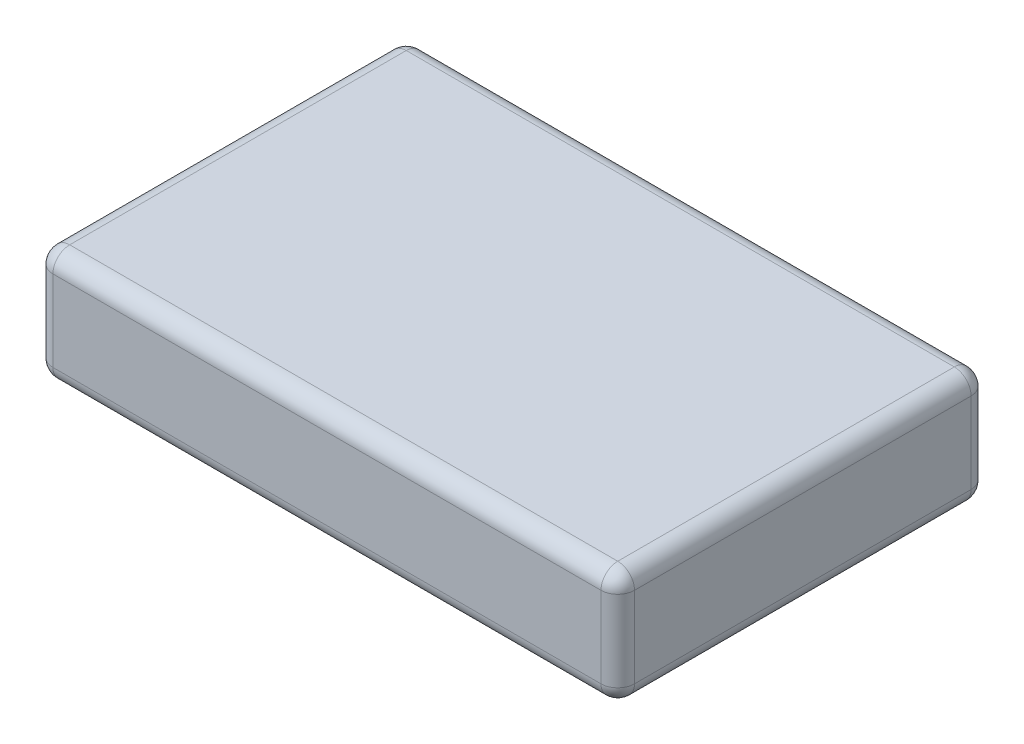
ISO-10303-21;
HEADER;
FILE_DESCRIPTION(('STEP AP214'),'2;1');
FILE_NAME('part.step','',(''),(''),'','','');
FILE_SCHEMA(('AUTOMOTIVE_DESIGN { 1 0 10303 214 1 1 1 1 }'));
ENDSEC;
DATA;
#1=APPLICATION_CONTEXT('core data for automotive mechanical design processes');
#2=APPLICATION_PROTOCOL_DEFINITION('international standard','automotive_design',2000,#1);
#3=PRODUCT_CONTEXT('',#1,'mechanical');
#4=PRODUCT('Part','Part','',(#3));
#5=PRODUCT_RELATED_PRODUCT_CATEGORY('part','',(#4));
#6=PRODUCT_DEFINITION_FORMATION('','',#4);
#7=PRODUCT_DEFINITION_CONTEXT('part definition',#1,'design');
#8=PRODUCT_DEFINITION('design','',#6,#7);
#9=PRODUCT_DEFINITION_SHAPE('','',#8);
#10=(LENGTH_UNIT() NAMED_UNIT(*) SI_UNIT(.MILLI.,.METRE.));
#11=(NAMED_UNIT(*) PLANE_ANGLE_UNIT() SI_UNIT($,.RADIAN.));
#12=(NAMED_UNIT(*) SI_UNIT($,.STERADIAN.) SOLID_ANGLE_UNIT());
#13=UNCERTAINTY_MEASURE_WITH_UNIT(LENGTH_MEASURE(1.E-05),#10,'distance_accuracy_value','');
#14=(GEOMETRIC_REPRESENTATION_CONTEXT(3) GLOBAL_UNCERTAINTY_ASSIGNED_CONTEXT((#13)) GLOBAL_UNIT_ASSIGNED_CONTEXT((#10,
#11,#12)) REPRESENTATION_CONTEXT('',''));
#15=CARTESIAN_POINT('',(0.,0.,0.));
#16=DIRECTION('',(0.,0.,1.));
#17=DIRECTION('',(1.,0.,0.));
#18=AXIS2_PLACEMENT_3D('',#15,#16,#17);
#19=CARTESIAN_POINT('',(33.,13.,21.));
#20=DIRECTION('',(-1.,0.,0.));
#21=DIRECTION('',(0.,0.,1.));
#22=AXIS2_PLACEMENT_3D('',#19,#20,#21);
#23=PLANE('',#22);
#24=DIRECTION('',(0.,-1.,0.));
#25=VECTOR('',#24,1.);
#26=CARTESIAN_POINT('',(33.,13.,-19.095));
#27=LINE('',#26,#25);
#28=CARTESIAN_POINT('',(33.,1.905,-19.095));
#29=VERTEX_POINT('',#28);
#30=CARTESIAN_POINT('',(33.,11.095,-19.095));
#31=VERTEX_POINT('',#30);
#32=EDGE_CURVE('E187',#29,#31,#27,.F.);
#33=ORIENTED_EDGE('',*,*,#32,.T.);
#34=DIRECTION('',(0.,0.,-1.));
#35=VECTOR('',#34,1.);
#36=CARTESIAN_POINT('',(33.,11.095,21.));
#37=LINE('',#36,#35);
#38=CARTESIAN_POINT('',(33.,11.095,19.095));
#39=VERTEX_POINT('',#38);
#40=EDGE_CURVE('E189',#31,#39,#37,.F.);
#41=ORIENTED_EDGE('',*,*,#40,.T.);
#42=DIRECTION('',(0.,-1.,0.));
#43=VECTOR('',#42,1.);
#44=CARTESIAN_POINT('',(33.,13.,19.095));
#45=LINE('',#44,#43);
#46=CARTESIAN_POINT('',(33.,1.905,19.095));
#47=VERTEX_POINT('',#46);
#48=EDGE_CURVE('E183',#39,#47,#45,.T.);
#49=ORIENTED_EDGE('',*,*,#48,.T.);
#50=DIRECTION('',(0.,0.,-1.));
#51=VECTOR('',#50,1.);
#52=CARTESIAN_POINT('',(33.,1.905,-21.));
#53=LINE('',#52,#51);
#54=EDGE_CURVE('E185',#47,#29,#53,.T.);
#55=ORIENTED_EDGE('',*,*,#54,.T.);
#56=EDGE_LOOP('',(#33,#41,#49,#55));
#57=FACE_BOUND('',#56,.T.);
#58=ADVANCED_FACE('F39',(#57),#23,.F.);
#59=CARTESIAN_POINT('',(-33.,13.,-21.));
#60=DIRECTION('',(0.,0.,1.));
#61=DIRECTION('',(1.,0.,0.));
#62=AXIS2_PLACEMENT_3D('',#59,#60,#61);
#63=PLANE('',#62);
#64=DIRECTION('',(-1.,0.,0.));
#65=VECTOR('',#64,1.);
#66=CARTESIAN_POINT('',(-33.,11.095,-21.));
#67=LINE('',#66,#65);
#68=CARTESIAN_POINT('',(-31.095,11.095,-21.));
#69=VERTEX_POINT('',#68);
#70=CARTESIAN_POINT('',(31.095,11.095,-21.));
#71=VERTEX_POINT('',#70);
#72=EDGE_CURVE('E157',#69,#71,#67,.F.);
#73=ORIENTED_EDGE('',*,*,#72,.T.);
#74=DIRECTION('',(0.,-1.,0.));
#75=VECTOR('',#74,1.);
#76=CARTESIAN_POINT('',(31.095,13.,-21.));
#77=LINE('',#76,#75);
#78=CARTESIAN_POINT('',(31.095,1.905,-21.));
#79=VERTEX_POINT('',#78);
#80=EDGE_CURVE('E161',#71,#79,#77,.T.);
#81=ORIENTED_EDGE('',*,*,#80,.T.);
#82=DIRECTION('',(-1.,0.,0.));
#83=VECTOR('',#82,1.);
#84=CARTESIAN_POINT('',(-33.,1.905,-21.));
#85=LINE('',#84,#83);
#86=CARTESIAN_POINT('',(-31.095,1.905,-21.));
#87=VERTEX_POINT('',#86);
#88=EDGE_CURVE('E133',#79,#87,#85,.T.);
#89=ORIENTED_EDGE('',*,*,#88,.T.);
#90=DIRECTION('',(0.,-1.,0.));
#91=VECTOR('',#90,1.);
#92=CARTESIAN_POINT('',(-31.095,13.,-21.));
#93=LINE('',#92,#91);
#94=EDGE_CURVE('E151',#87,#69,#93,.F.);
#95=ORIENTED_EDGE('',*,*,#94,.T.);
#96=EDGE_LOOP('',(#73,#81,#89,#95));
#97=FACE_BOUND('',#96,.T.);
#98=ADVANCED_FACE('F159',(#97),#63,.F.);
#99=CARTESIAN_POINT('',(-33.,13.,21.));
#100=DIRECTION('',(1.,0.,0.));
#101=DIRECTION('',(0.,0.,-1.));
#102=AXIS2_PLACEMENT_3D('',#99,#100,#101);
#103=PLANE('',#102);
#104=DIRECTION('',(0.,0.,1.));
#105=VECTOR('',#104,1.);
#106=CARTESIAN_POINT('',(-33.,11.095,21.));
#107=LINE('',#106,#105);
#108=CARTESIAN_POINT('',(-33.,11.095,19.095));
#109=VERTEX_POINT('',#108);
#110=CARTESIAN_POINT('',(-33.,11.095,-19.095));
#111=VERTEX_POINT('',#110);
#112=EDGE_CURVE('E48',#109,#111,#107,.F.);
#113=ORIENTED_EDGE('',*,*,#112,.T.);
#114=DIRECTION('',(0.,-1.,0.));
#115=VECTOR('',#114,1.);
#116=CARTESIAN_POINT('',(-33.,13.,-19.095));
#117=LINE('',#116,#115);
#118=CARTESIAN_POINT('',(-33.,1.905,-19.095));
#119=VERTEX_POINT('',#118);
#120=EDGE_CURVE('E11',#111,#119,#117,.T.);
#121=ORIENTED_EDGE('',*,*,#120,.T.);
#122=DIRECTION('',(0.,0.,1.));
#123=VECTOR('',#122,1.);
#124=CARTESIAN_POINT('',(-33.,1.905,21.));
#125=LINE('',#124,#123);
#126=CARTESIAN_POINT('',(-33.,1.905,19.095));
#127=VERTEX_POINT('',#126);
#128=EDGE_CURVE('E201',#119,#127,#125,.T.);
#129=ORIENTED_EDGE('',*,*,#128,.T.);
#130=DIRECTION('',(0.,-1.,0.));
#131=VECTOR('',#130,1.);
#132=CARTESIAN_POINT('',(-33.,13.,19.095));
#133=LINE('',#132,#131);
#134=EDGE_CURVE('E59',#127,#109,#133,.F.);
#135=ORIENTED_EDGE('',*,*,#134,.T.);
#136=EDGE_LOOP('',(#113,#121,#129,#135));
#137=FACE_BOUND('',#136,.T.);
#138=ADVANCED_FACE('F305',(#137),#103,.F.);
#139=CARTESIAN_POINT('',(-33.,13.,21.));
#140=DIRECTION('',(0.,0.,-1.));
#141=DIRECTION('',(-1.,0.,0.));
#142=AXIS2_PLACEMENT_3D('',#139,#140,#141);
#143=PLANE('',#142);
#144=DIRECTION('',(0.,-1.,0.));
#145=VECTOR('',#144,1.);
#146=CARTESIAN_POINT('',(31.095,13.,21.));
#147=LINE('',#146,#145);
#148=CARTESIAN_POINT('',(31.095,1.905,21.));
#149=VERTEX_POINT('',#148);
#150=CARTESIAN_POINT('',(31.095,11.095,21.));
#151=VERTEX_POINT('',#150);
#152=EDGE_CURVE('E196',#149,#151,#147,.F.);
#153=ORIENTED_EDGE('',*,*,#152,.T.);
#154=DIRECTION('',(1.,0.,0.));
#155=VECTOR('',#154,1.);
#156=CARTESIAN_POINT('',(-33.,11.095,21.));
#157=LINE('',#156,#155);
#158=CARTESIAN_POINT('',(-31.095,11.095,21.));
#159=VERTEX_POINT('',#158);
#160=EDGE_CURVE('E198',#151,#159,#157,.F.);
#161=ORIENTED_EDGE('',*,*,#160,.T.);
#162=DIRECTION('',(0.,-1.,0.));
#163=VECTOR('',#162,1.);
#164=CARTESIAN_POINT('',(-31.095,13.,21.));
#165=LINE('',#164,#163);
#166=CARTESIAN_POINT('',(-31.095,1.905,21.));
#167=VERTEX_POINT('',#166);
#168=EDGE_CURVE('E192',#159,#167,#165,.T.);
#169=ORIENTED_EDGE('',*,*,#168,.T.);
#170=DIRECTION('',(1.,0.,0.));
#171=VECTOR('',#170,1.);
#172=CARTESIAN_POINT('',(33.,1.905,21.));
#173=LINE('',#172,#171);
#174=EDGE_CURVE('E194',#167,#149,#173,.T.);
#175=ORIENTED_EDGE('',*,*,#174,.T.);
#176=EDGE_LOOP('',(#153,#161,#169,#175));
#177=FACE_BOUND('',#176,.T.);
#178=ADVANCED_FACE('F307',(#177),#143,.F.);
#179=CARTESIAN_POINT('',(0.,13.,0.));
#180=DIRECTION('',(0.,-1.,0.));
#181=DIRECTION('',(0.,0.,-1.));
#182=AXIS2_PLACEMENT_3D('',#179,#180,#181);
#183=PLANE('',#182);
#184=DIRECTION('',(0.,0.,-1.));
#185=VECTOR('',#184,1.);
#186=CARTESIAN_POINT('',(31.095,13.,0.));
#187=LINE('',#186,#185);
#188=CARTESIAN_POINT('',(31.095,13.,19.095));
#189=VERTEX_POINT('',#188);
#190=CARTESIAN_POINT('',(31.095,13.,-19.095));
#191=VERTEX_POINT('',#190);
#192=EDGE_CURVE('E178',#189,#191,#187,.T.);
#193=ORIENTED_EDGE('',*,*,#192,.T.);
#194=DIRECTION('',(-1.,0.,0.));
#195=VECTOR('',#194,1.);
#196=CARTESIAN_POINT('',(0.,13.,-19.095));
#197=LINE('',#196,#195);
#198=CARTESIAN_POINT('',(-31.095,13.,-19.095));
#199=VERTEX_POINT('',#198);
#200=EDGE_CURVE('E180',#191,#199,#197,.T.);
#201=ORIENTED_EDGE('',*,*,#200,.T.);
#202=DIRECTION('',(0.,0.,1.));
#203=VECTOR('',#202,1.);
#204=CARTESIAN_POINT('',(-31.095,13.,0.));
#205=LINE('',#204,#203);
#206=CARTESIAN_POINT('',(-31.095,13.,19.095));
#207=VERTEX_POINT('',#206);
#208=EDGE_CURVE('E174',#199,#207,#205,.T.);
#209=ORIENTED_EDGE('',*,*,#208,.T.);
#210=DIRECTION('',(1.,0.,0.));
#211=VECTOR('',#210,1.);
#212=CARTESIAN_POINT('',(0.,13.,19.095));
#213=LINE('',#212,#211);
#214=EDGE_CURVE('E176',#207,#189,#213,.T.);
#215=ORIENTED_EDGE('',*,*,#214,.T.);
#216=EDGE_LOOP('',(#193,#201,#209,#215));
#217=FACE_BOUND('',#216,.T.);
#218=ADVANCED_FACE('F313',(#217),#183,.F.);
#219=CARTESIAN_POINT('',(0.,0.,0.));
#220=DIRECTION('',(0.,-1.,0.));
#221=DIRECTION('',(0.,0.,-1.));
#222=AXIS2_PLACEMENT_3D('',#219,#220,#221);
#223=PLANE('',#222);
#224=DIRECTION('',(0.,0.,1.));
#225=VECTOR('',#224,1.);
#226=CARTESIAN_POINT('',(-31.095,0.,-21.));
#227=LINE('',#226,#225);
#228=CARTESIAN_POINT('',(-31.095,0.,19.095));
#229=VERTEX_POINT('',#228);
#230=CARTESIAN_POINT('',(-31.095,0.,-19.095));
#231=VERTEX_POINT('',#230);
#232=EDGE_CURVE('E164',#229,#231,#227,.F.);
#233=ORIENTED_EDGE('',*,*,#232,.T.);
#234=DIRECTION('',(-1.,0.,0.));
#235=VECTOR('',#234,1.);
#236=CARTESIAN_POINT('',(33.,0.,-19.095));
#237=LINE('',#236,#235);
#238=CARTESIAN_POINT('',(31.095,0.,-19.095));
#239=VERTEX_POINT('',#238);
#240=EDGE_CURVE('E135',#231,#239,#237,.F.);
#241=ORIENTED_EDGE('',*,*,#240,.T.);
#242=DIRECTION('',(0.,0.,-1.));
#243=VECTOR('',#242,1.);
#244=CARTESIAN_POINT('',(31.095,0.,21.));
#245=LINE('',#244,#243);
#246=CARTESIAN_POINT('',(31.095,0.,19.095));
#247=VERTEX_POINT('',#246);
#248=EDGE_CURVE('E171',#239,#247,#245,.F.);
#249=ORIENTED_EDGE('',*,*,#248,.T.);
#250=DIRECTION('',(1.,0.,0.));
#251=VECTOR('',#250,1.);
#252=CARTESIAN_POINT('',(-33.,0.,19.095));
#253=LINE('',#252,#251);
#254=EDGE_CURVE('E169',#247,#229,#253,.F.);
#255=ORIENTED_EDGE('',*,*,#254,.T.);
#256=EDGE_LOOP('',(#233,#241,#249,#255));
#257=FACE_BOUND('',#256,.T.);
#258=ADVANCED_FACE('F299',(#257),#223,.T.);
#259=CARTESIAN_POINT('',(0.,11.095,19.095));
#260=DIRECTION('',(1.,0.,0.));
#261=DIRECTION('',(0.,0.,-1.));
#262=AXIS2_PLACEMENT_3D('',#259,#260,#261);
#263=CYLINDRICAL_SURFACE('',#262,1.905);
#264=CARTESIAN_POINT('',(31.095,11.095,19.095));
#265=DIRECTION('',(1.,0.,0.));
#266=DIRECTION('',(0.,0.,-1.));
#267=AXIS2_PLACEMENT_3D('',#264,#265,#266);
#268=CIRCLE('',#267,1.905);
#269=EDGE_CURVE('E43',#189,#151,#268,.T.);
#270=ORIENTED_EDGE('',*,*,#269,.F.);
#271=ORIENTED_EDGE('',*,*,#214,.F.);
#272=CARTESIAN_POINT('',(-31.095,11.095,19.095));
#273=DIRECTION('',(-1.,0.,0.));
#274=DIRECTION('',(0.,0.,1.));
#275=AXIS2_PLACEMENT_3D('',#272,#273,#274);
#276=CIRCLE('',#275,1.905);
#277=EDGE_CURVE('E255',#159,#207,#276,.T.);
#278=ORIENTED_EDGE('',*,*,#277,.F.);
#279=ORIENTED_EDGE('',*,*,#160,.F.);
#280=EDGE_LOOP('',(#270,#271,#278,#279));
#281=FACE_BOUND('',#280,.T.);
#282=ADVANCED_FACE('F41',(#281),#263,.T.);
#283=CARTESIAN_POINT('',(31.095,11.095,19.095));
#284=DIRECTION('',(0.,0.,1.));
#285=DIRECTION('',(1.,0.,0.));
#286=AXIS2_PLACEMENT_3D('',#283,#284,#285);
#287=SPHERICAL_SURFACE('',#286,1.905);
#288=CARTESIAN_POINT('',(31.095,11.095,19.095));
#289=DIRECTION('',(0.,0.,1.));
#290=DIRECTION('',(1.,0.,0.));
#291=AXIS2_PLACEMENT_3D('',#288,#289,#290);
#292=CIRCLE('',#291,1.905);
#293=EDGE_CURVE('E250',#189,#39,#292,.F.);
#294=ORIENTED_EDGE('',*,*,#293,.F.);
#295=ORIENTED_EDGE('',*,*,#269,.T.);
#296=CARTESIAN_POINT('',(31.095,11.095,19.095));
#297=DIRECTION('',(0.,1.,0.));
#298=DIRECTION('',(0.,0.,1.));
#299=AXIS2_PLACEMENT_3D('',#296,#297,#298);
#300=CIRCLE('',#299,1.905);
#301=EDGE_CURVE('E253',#39,#151,#300,.F.);
#302=ORIENTED_EDGE('',*,*,#301,.F.);
#303=EDGE_LOOP('',(#294,#295,#302));
#304=FACE_BOUND('',#303,.T.);
#305=ADVANCED_FACE('F266',(#304),#287,.T.);
#306=CARTESIAN_POINT('',(-31.095,11.095,19.095));
#307=DIRECTION('',(0.,0.,1.));
#308=DIRECTION('',(1.,0.,0.));
#309=AXIS2_PLACEMENT_3D('',#306,#307,#308);
#310=SPHERICAL_SURFACE('',#309,1.905);
#311=CARTESIAN_POINT('',(-31.095,11.095,19.095));
#312=DIRECTION('',(0.,1.,0.));
#313=DIRECTION('',(0.,0.,1.));
#314=AXIS2_PLACEMENT_3D('',#311,#312,#313);
#315=CIRCLE('',#314,1.905);
#316=EDGE_CURVE('E245',#159,#109,#315,.F.);
#317=ORIENTED_EDGE('',*,*,#316,.F.);
#318=ORIENTED_EDGE('',*,*,#277,.T.);
#319=CARTESIAN_POINT('',(-31.095,11.095,19.095));
#320=DIRECTION('',(0.,0.,1.));
#321=DIRECTION('',(1.,0.,0.));
#322=AXIS2_PLACEMENT_3D('',#319,#320,#321);
#323=CIRCLE('',#322,1.905);
#324=EDGE_CURVE('E247',#109,#207,#323,.F.);
#325=ORIENTED_EDGE('',*,*,#324,.F.);
#326=EDGE_LOOP('',(#317,#318,#325));
#327=FACE_BOUND('',#326,.T.);
#328=ADVANCED_FACE('F370',(#327),#310,.T.);
#329=CARTESIAN_POINT('',(31.095,13.,19.095));
#330=DIRECTION('',(0.,-1.,0.));
#331=DIRECTION('',(0.,0.,-1.));
#332=AXIS2_PLACEMENT_3D('',#329,#330,#331);
#333=CYLINDRICAL_SURFACE('',#332,1.905);
#334=ORIENTED_EDGE('',*,*,#301,.T.);
#335=ORIENTED_EDGE('',*,*,#152,.F.);
#336=CARTESIAN_POINT('',(31.095,1.905,19.095));
#337=DIRECTION('',(0.,-1.,0.));
#338=DIRECTION('',(0.,0.,-1.));
#339=AXIS2_PLACEMENT_3D('',#336,#337,#338);
#340=CIRCLE('',#339,1.905);
#341=EDGE_CURVE('E239',#47,#149,#340,.T.);
#342=ORIENTED_EDGE('',*,*,#341,.F.);
#343=ORIENTED_EDGE('',*,*,#48,.F.);
#344=EDGE_LOOP('',(#334,#335,#342,#343));
#345=FACE_BOUND('',#344,.T.);
#346=ADVANCED_FACE('F273',(#345),#333,.T.);
#347=CARTESIAN_POINT('',(31.095,11.095,0.));
#348=DIRECTION('',(0.,0.,-1.));
#349=DIRECTION('',(-1.,0.,0.));
#350=AXIS2_PLACEMENT_3D('',#347,#348,#349);
#351=CYLINDRICAL_SURFACE('',#350,1.905);
#352=ORIENTED_EDGE('',*,*,#293,.T.);
#353=ORIENTED_EDGE('',*,*,#40,.F.);
#354=CARTESIAN_POINT('',(31.095,11.095,-19.095));
#355=DIRECTION('',(0.,0.,-1.));
#356=DIRECTION('',(-1.,0.,0.));
#357=AXIS2_PLACEMENT_3D('',#354,#355,#356);
#358=CIRCLE('',#357,1.905);
#359=EDGE_CURVE('E236',#191,#31,#358,.T.);
#360=ORIENTED_EDGE('',*,*,#359,.F.);
#361=ORIENTED_EDGE('',*,*,#192,.F.);
#362=EDGE_LOOP('',(#352,#353,#360,#361));
#363=FACE_BOUND('',#362,.T.);
#364=ADVANCED_FACE('F283',(#363),#351,.T.);
#365=CARTESIAN_POINT('',(0.,11.095,-19.095));
#366=DIRECTION('',(-1.,0.,0.));
#367=DIRECTION('',(0.,0.,1.));
#368=AXIS2_PLACEMENT_3D('',#365,#366,#367);
#369=CYLINDRICAL_SURFACE('',#368,1.905);
#370=CARTESIAN_POINT('',(-31.095,11.095,-19.095));
#371=DIRECTION('',(-1.,0.,0.));
#372=DIRECTION('',(0.,0.,1.));
#373=AXIS2_PLACEMENT_3D('',#370,#371,#372);
#374=CIRCLE('',#373,1.905);
#375=EDGE_CURVE('E230',#199,#69,#374,.T.);
#376=ORIENTED_EDGE('',*,*,#375,.F.);
#377=ORIENTED_EDGE('',*,*,#200,.F.);
#378=CARTESIAN_POINT('',(31.095,11.095,-19.095));
#379=DIRECTION('',(1.,0.,0.));
#380=DIRECTION('',(0.,1.,0.));
#381=AXIS2_PLACEMENT_3D('',#378,#379,#380);
#382=CIRCLE('',#381,1.905);
#383=EDGE_CURVE('E233',#71,#191,#382,.T.);
#384=ORIENTED_EDGE('',*,*,#383,.F.);
#385=ORIENTED_EDGE('',*,*,#72,.F.);
#386=EDGE_LOOP('',(#376,#377,#384,#385));
#387=FACE_BOUND('',#386,.T.);
#388=ADVANCED_FACE('F361',(#387),#369,.T.);
#389=CARTESIAN_POINT('',(-31.095,11.095,0.));
#390=DIRECTION('',(0.,0.,1.));
#391=DIRECTION('',(1.,0.,0.));
#392=AXIS2_PLACEMENT_3D('',#389,#390,#391);
#393=CYLINDRICAL_SURFACE('',#392,1.905);
#394=ORIENTED_EDGE('',*,*,#324,.T.);
#395=ORIENTED_EDGE('',*,*,#208,.F.);
#396=CARTESIAN_POINT('',(-31.095,11.095,-19.095));
#397=DIRECTION('',(0.,0.,-1.));
#398=DIRECTION('',(0.,1.,0.));
#399=AXIS2_PLACEMENT_3D('',#396,#397,#398);
#400=CIRCLE('',#399,1.905);
#401=EDGE_CURVE('E228',#111,#199,#400,.T.);
#402=ORIENTED_EDGE('',*,*,#401,.F.);
#403=ORIENTED_EDGE('',*,*,#112,.F.);
#404=EDGE_LOOP('',(#394,#395,#402,#403));
#405=FACE_BOUND('',#404,.T.);
#406=ADVANCED_FACE('F357',(#405),#393,.T.);
#407=CARTESIAN_POINT('',(-31.095,13.,19.095));
#408=DIRECTION('',(0.,-1.,0.));
#409=DIRECTION('',(0.,0.,-1.));
#410=AXIS2_PLACEMENT_3D('',#407,#408,#409);
#411=CYLINDRICAL_SURFACE('',#410,1.905);
#412=ORIENTED_EDGE('',*,*,#316,.T.);
#413=ORIENTED_EDGE('',*,*,#134,.F.);
#414=CARTESIAN_POINT('',(-31.095,1.905,19.095));
#415=DIRECTION('',(0.,-1.,0.));
#416=DIRECTION('',(0.,0.,-1.));
#417=AXIS2_PLACEMENT_3D('',#414,#415,#416);
#418=CIRCLE('',#417,1.905);
#419=EDGE_CURVE('E225',#167,#127,#418,.T.);
#420=ORIENTED_EDGE('',*,*,#419,.F.);
#421=ORIENTED_EDGE('',*,*,#168,.F.);
#422=EDGE_LOOP('',(#412,#413,#420,#421));
#423=FACE_BOUND('',#422,.T.);
#424=ADVANCED_FACE('F353',(#423),#411,.T.);
#425=CARTESIAN_POINT('',(-33.,1.905,19.095));
#426=DIRECTION('',(-1.,0.,0.));
#427=DIRECTION('',(0.,0.,1.));
#428=AXIS2_PLACEMENT_3D('',#425,#426,#427);
#429=CYLINDRICAL_SURFACE('',#428,1.905);
#430=CARTESIAN_POINT('',(31.095,1.905,19.095));
#431=DIRECTION('',(1.,0.,0.));
#432=DIRECTION('',(0.,0.,-1.));
#433=AXIS2_PLACEMENT_3D('',#430,#431,#432);
#434=CIRCLE('',#433,1.905);
#435=EDGE_CURVE('E242',#149,#247,#434,.T.);
#436=ORIENTED_EDGE('',*,*,#435,.F.);
#437=ORIENTED_EDGE('',*,*,#174,.F.);
#438=CARTESIAN_POINT('',(-31.095,1.905,19.095));
#439=DIRECTION('',(-1.,0.,0.));
#440=DIRECTION('',(0.,0.,1.));
#441=AXIS2_PLACEMENT_3D('',#438,#439,#440);
#442=CIRCLE('',#441,1.905);
#443=EDGE_CURVE('E222',#229,#167,#442,.T.);
#444=ORIENTED_EDGE('',*,*,#443,.F.);
#445=ORIENTED_EDGE('',*,*,#254,.F.);
#446=EDGE_LOOP('',(#436,#437,#444,#445));
#447=FACE_BOUND('',#446,.T.);
#448=ADVANCED_FACE('F349',(#447),#429,.T.);
#449=CARTESIAN_POINT('',(31.095,1.905,19.095));
#450=DIRECTION('',(0.,0.,1.));
#451=DIRECTION('',(1.,0.,0.));
#452=AXIS2_PLACEMENT_3D('',#449,#450,#451);
#453=SPHERICAL_SURFACE('',#452,1.905);
#454=ORIENTED_EDGE('',*,*,#341,.T.);
#455=ORIENTED_EDGE('',*,*,#435,.T.);
#456=CARTESIAN_POINT('',(31.095,1.905,19.095));
#457=DIRECTION('',(0.,0.,1.));
#458=DIRECTION('',(1.,0.,0.));
#459=AXIS2_PLACEMENT_3D('',#456,#457,#458);
#460=CIRCLE('',#459,1.905);
#461=EDGE_CURVE('E219',#47,#247,#460,.F.);
#462=ORIENTED_EDGE('',*,*,#461,.F.);
#463=EDGE_LOOP('',(#454,#455,#462));
#464=FACE_BOUND('',#463,.T.);
#465=ADVANCED_FACE('F346',(#464),#453,.T.);
#466=CARTESIAN_POINT('',(31.095,11.095,-19.095));
#467=DIRECTION('',(0.,0.,1.));
#468=DIRECTION('',(1.,0.,0.));
#469=AXIS2_PLACEMENT_3D('',#466,#467,#468);
#470=SPHERICAL_SURFACE('',#469,1.905);
#471=ORIENTED_EDGE('',*,*,#383,.T.);
#472=ORIENTED_EDGE('',*,*,#359,.T.);
#473=CARTESIAN_POINT('',(31.095,11.095,-19.095));
#474=DIRECTION('',(0.,1.,0.));
#475=DIRECTION('',(0.,0.,1.));
#476=AXIS2_PLACEMENT_3D('',#473,#474,#475);
#477=CIRCLE('',#476,1.905);
#478=EDGE_CURVE('E216',#71,#31,#477,.F.);
#479=ORIENTED_EDGE('',*,*,#478,.F.);
#480=EDGE_LOOP('',(#471,#472,#479));
#481=FACE_BOUND('',#480,.T.);
#482=ADVANCED_FACE('F286',(#481),#470,.T.);
#483=CARTESIAN_POINT('',(-31.095,11.095,-19.095));
#484=DIRECTION('',(0.,0.,1.));
#485=DIRECTION('',(1.,0.,0.));
#486=AXIS2_PLACEMENT_3D('',#483,#484,#485);
#487=SPHERICAL_SURFACE('',#486,1.905);
#488=ORIENTED_EDGE('',*,*,#401,.T.);
#489=ORIENTED_EDGE('',*,*,#375,.T.);
#490=CARTESIAN_POINT('',(-31.095,11.095,-19.095));
#491=DIRECTION('',(0.,1.,0.));
#492=DIRECTION('',(0.,0.,1.));
#493=AXIS2_PLACEMENT_3D('',#490,#491,#492);
#494=CIRCLE('',#493,1.905);
#495=EDGE_CURVE('E154',#111,#69,#494,.F.);
#496=ORIENTED_EDGE('',*,*,#495,.F.);
#497=EDGE_LOOP('',(#488,#489,#496));
#498=FACE_BOUND('',#497,.T.);
#499=ADVANCED_FACE('F339',(#498),#487,.T.);
#500=CARTESIAN_POINT('',(-31.095,1.905,19.095));
#501=DIRECTION('',(0.,0.,1.));
#502=DIRECTION('',(1.,0.,0.));
#503=AXIS2_PLACEMENT_3D('',#500,#501,#502);
#504=SPHERICAL_SURFACE('',#503,1.905);
#505=ORIENTED_EDGE('',*,*,#443,.T.);
#506=ORIENTED_EDGE('',*,*,#419,.T.);
#507=CARTESIAN_POINT('',(-31.095,1.905,19.095));
#508=DIRECTION('',(0.,0.,1.));
#509=DIRECTION('',(1.,0.,0.));
#510=AXIS2_PLACEMENT_3D('',#507,#508,#509);
#511=CIRCLE('',#510,1.905);
#512=EDGE_CURVE('E212',#229,#127,#511,.F.);
#513=ORIENTED_EDGE('',*,*,#512,.F.);
#514=EDGE_LOOP('',(#505,#506,#513));
#515=FACE_BOUND('',#514,.T.);
#516=ADVANCED_FACE('F336',(#515),#504,.T.);
#517=CARTESIAN_POINT('',(31.095,1.905,21.));
#518=DIRECTION('',(0.,0.,1.));
#519=DIRECTION('',(1.,0.,0.));
#520=AXIS2_PLACEMENT_3D('',#517,#518,#519);
#521=CYLINDRICAL_SURFACE('',#520,1.905);
#522=ORIENTED_EDGE('',*,*,#461,.T.);
#523=ORIENTED_EDGE('',*,*,#248,.F.);
#524=CARTESIAN_POINT('',(31.095,1.905,-19.095));
#525=DIRECTION('',(0.,0.,-1.));
#526=DIRECTION('',(-1.,0.,0.));
#527=AXIS2_PLACEMENT_3D('',#524,#525,#526);
#528=CIRCLE('',#527,1.905);
#529=EDGE_CURVE('E209',#29,#239,#528,.T.);
#530=ORIENTED_EDGE('',*,*,#529,.F.);
#531=ORIENTED_EDGE('',*,*,#54,.F.);
#532=EDGE_LOOP('',(#522,#523,#530,#531));
#533=FACE_BOUND('',#532,.T.);
#534=ADVANCED_FACE('F296',(#533),#521,.T.);
#535=CARTESIAN_POINT('',(31.095,13.,-19.095));
#536=DIRECTION('',(0.,-1.,0.));
#537=DIRECTION('',(0.,0.,-1.));
#538=AXIS2_PLACEMENT_3D('',#535,#536,#537);
#539=CYLINDRICAL_SURFACE('',#538,1.905);
#540=ORIENTED_EDGE('',*,*,#478,.T.);
#541=ORIENTED_EDGE('',*,*,#32,.F.);
#542=CARTESIAN_POINT('',(31.095,1.905,-19.095));
#543=DIRECTION('',(0.,-1.,0.));
#544=DIRECTION('',(0.,0.,-1.));
#545=AXIS2_PLACEMENT_3D('',#542,#543,#544);
#546=CIRCLE('',#545,1.905);
#547=EDGE_CURVE('E148',#79,#29,#546,.T.);
#548=ORIENTED_EDGE('',*,*,#547,.F.);
#549=ORIENTED_EDGE('',*,*,#80,.F.);
#550=EDGE_LOOP('',(#540,#541,#548,#549));
#551=FACE_BOUND('',#550,.T.);
#552=ADVANCED_FACE('F289',(#551),#539,.T.);
#553=CARTESIAN_POINT('',(-31.095,13.,-19.095));
#554=DIRECTION('',(0.,-1.,0.));
#555=DIRECTION('',(0.,0.,-1.));
#556=AXIS2_PLACEMENT_3D('',#553,#554,#555);
#557=CYLINDRICAL_SURFACE('',#556,1.905);
#558=ORIENTED_EDGE('',*,*,#495,.T.);
#559=ORIENTED_EDGE('',*,*,#94,.F.);
#560=CARTESIAN_POINT('',(-31.095,1.905,-19.095));
#561=DIRECTION('',(0.,-1.,0.));
#562=DIRECTION('',(0.,0.,-1.));
#563=AXIS2_PLACEMENT_3D('',#560,#561,#562);
#564=CIRCLE('',#563,1.905);
#565=EDGE_CURVE('E140',#119,#87,#564,.T.);
#566=ORIENTED_EDGE('',*,*,#565,.F.);
#567=ORIENTED_EDGE('',*,*,#120,.F.);
#568=EDGE_LOOP('',(#558,#559,#566,#567));
#569=FACE_BOUND('',#568,.T.);
#570=ADVANCED_FACE('F152',(#569),#557,.T.);
#571=CARTESIAN_POINT('',(-31.095,1.905,21.));
#572=DIRECTION('',(0.,0.,-1.));
#573=DIRECTION('',(-1.,0.,0.));
#574=AXIS2_PLACEMENT_3D('',#571,#572,#573);
#575=CYLINDRICAL_SURFACE('',#574,1.905);
#576=ORIENTED_EDGE('',*,*,#512,.T.);
#577=ORIENTED_EDGE('',*,*,#128,.F.);
#578=CARTESIAN_POINT('',(-31.095,1.905,-19.095));
#579=DIRECTION('',(0.,0.,-1.));
#580=DIRECTION('',(-1.,0.,0.));
#581=AXIS2_PLACEMENT_3D('',#578,#579,#580);
#582=CIRCLE('',#581,1.905);
#583=EDGE_CURVE('E144',#231,#119,#582,.T.);
#584=ORIENTED_EDGE('',*,*,#583,.F.);
#585=ORIENTED_EDGE('',*,*,#232,.F.);
#586=EDGE_LOOP('',(#576,#577,#584,#585));
#587=FACE_BOUND('',#586,.T.);
#588=ADVANCED_FACE('F303',(#587),#575,.T.);
#589=CARTESIAN_POINT('',(31.095,1.905,-19.095));
#590=DIRECTION('',(0.,0.,1.));
#591=DIRECTION('',(1.,0.,0.));
#592=AXIS2_PLACEMENT_3D('',#589,#590,#591);
#593=SPHERICAL_SURFACE('',#592,1.905);
#594=ORIENTED_EDGE('',*,*,#547,.T.);
#595=ORIENTED_EDGE('',*,*,#529,.T.);
#596=CARTESIAN_POINT('',(31.095,1.905,-19.095));
#597=DIRECTION('',(1.,0.,0.));
#598=DIRECTION('',(0.,0.,-1.));
#599=AXIS2_PLACEMENT_3D('',#596,#597,#598);
#600=CIRCLE('',#599,1.905);
#601=EDGE_CURVE('E137',#79,#239,#600,.F.);
#602=ORIENTED_EDGE('',*,*,#601,.F.);
#603=EDGE_LOOP('',(#594,#595,#602));
#604=FACE_BOUND('',#603,.T.);
#605=ADVANCED_FACE('F293',(#604),#593,.T.);
#606=CARTESIAN_POINT('',(-31.095,1.905,-19.095));
#607=DIRECTION('',(0.,0.,1.));
#608=DIRECTION('',(1.,0.,0.));
#609=AXIS2_PLACEMENT_3D('',#606,#607,#608);
#610=SPHERICAL_SURFACE('',#609,1.905);
#611=ORIENTED_EDGE('',*,*,#583,.T.);
#612=ORIENTED_EDGE('',*,*,#565,.T.);
#613=CARTESIAN_POINT('',(-31.095,1.905,-19.095));
#614=DIRECTION('',(-1.,0.,0.));
#615=DIRECTION('',(0.,0.,1.));
#616=AXIS2_PLACEMENT_3D('',#613,#614,#615);
#617=CIRCLE('',#616,1.905);
#618=EDGE_CURVE('E129',#231,#87,#617,.F.);
#619=ORIENTED_EDGE('',*,*,#618,.F.);
#620=EDGE_LOOP('',(#611,#612,#619));
#621=FACE_BOUND('',#620,.T.);
#622=ADVANCED_FACE('F142',(#621),#610,.T.);
#623=CARTESIAN_POINT('',(-33.,1.905,-19.095));
#624=DIRECTION('',(1.,0.,0.));
#625=DIRECTION('',(0.,0.,-1.));
#626=AXIS2_PLACEMENT_3D('',#623,#624,#625);
#627=CYLINDRICAL_SURFACE('',#626,1.905);
#628=ORIENTED_EDGE('',*,*,#601,.T.);
#629=ORIENTED_EDGE('',*,*,#240,.F.);
#630=ORIENTED_EDGE('',*,*,#618,.T.);
#631=ORIENTED_EDGE('',*,*,#88,.F.);
#632=EDGE_LOOP('',(#628,#629,#630,#631));
#633=FACE_BOUND('',#632,.T.);
#634=ADVANCED_FACE('F131',(#633),#627,.T.);
#635=CLOSED_SHELL('',(#58,#98,#138,#178,#218,#258,#282,#305,#328,#346,#364,#388,#406,#424,#448,
#465,#482,#499,#516,#534,#552,#570,#588,#605,#622,#634));
#636=MANIFOLD_SOLID_BREP('B2',#635);
#637=ADVANCED_BREP_SHAPE_REPRESENTATION('',(#18,#636),#14);
#638=SHAPE_DEFINITION_REPRESENTATION(#9,#637);
ENDSEC;
END-ISO-10303-21;
